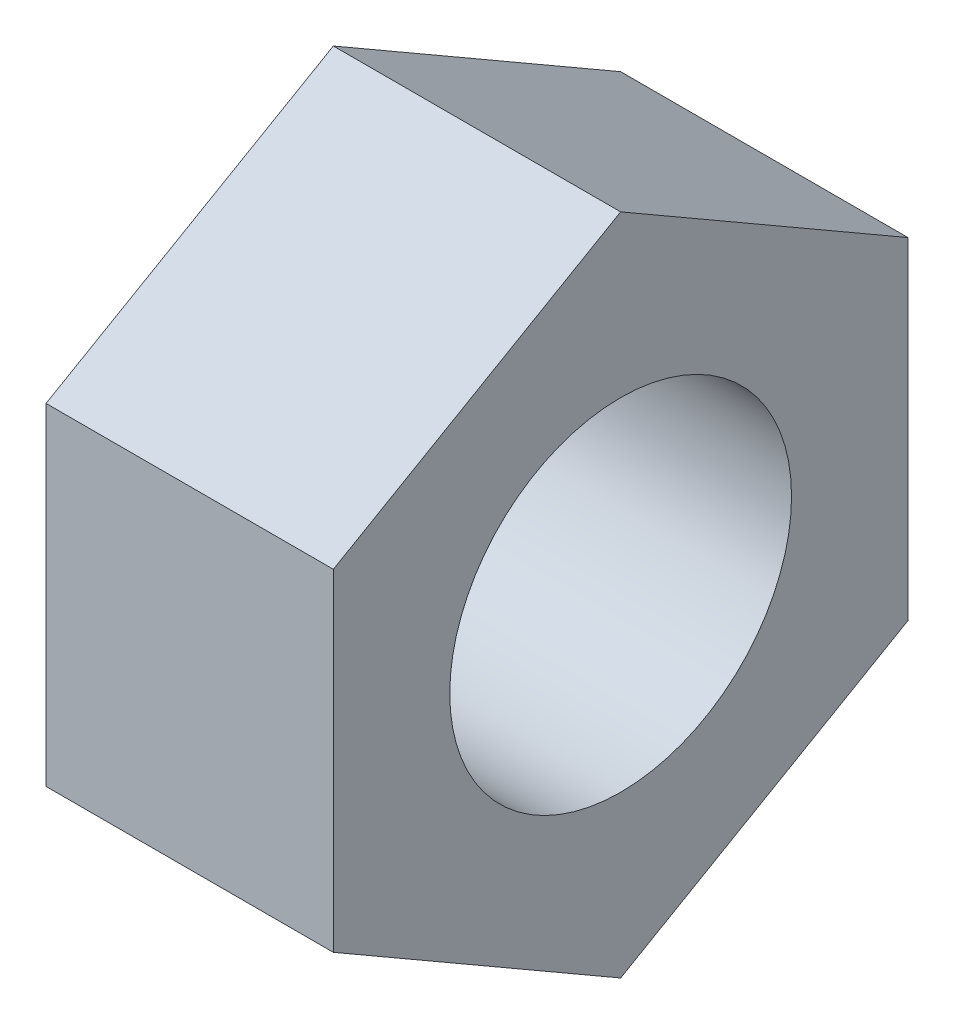
ISO-10303-21;
HEADER;
FILE_DESCRIPTION(('STEP AP214'),'2;1');
FILE_NAME('part.step','',(''),(''),'','','');
FILE_SCHEMA(('AUTOMOTIVE_DESIGN { 1 0 10303 214 1 1 1 1 }'));
ENDSEC;
DATA;
#1=APPLICATION_CONTEXT('core data for automotive mechanical design processes');
#2=APPLICATION_PROTOCOL_DEFINITION('international standard','automotive_design',2000,#1);
#3=PRODUCT_CONTEXT('',#1,'mechanical');
#4=PRODUCT('Part','Part','',(#3));
#5=PRODUCT_RELATED_PRODUCT_CATEGORY('part','',(#4));
#6=PRODUCT_DEFINITION_FORMATION('','',#4);
#7=PRODUCT_DEFINITION_CONTEXT('part definition',#1,'design');
#8=PRODUCT_DEFINITION('design','',#6,#7);
#9=PRODUCT_DEFINITION_SHAPE('','',#8);
#10=(LENGTH_UNIT() NAMED_UNIT(*) SI_UNIT(.MILLI.,.METRE.));
#11=(NAMED_UNIT(*) PLANE_ANGLE_UNIT() SI_UNIT($,.RADIAN.));
#12=(NAMED_UNIT(*) SI_UNIT($,.STERADIAN.) SOLID_ANGLE_UNIT());
#13=UNCERTAINTY_MEASURE_WITH_UNIT(LENGTH_MEASURE(1.E-05),#10,'distance_accuracy_value','');
#14=(GEOMETRIC_REPRESENTATION_CONTEXT(3) GLOBAL_UNCERTAINTY_ASSIGNED_CONTEXT((#13)) GLOBAL_UNIT_ASSIGNED_CONTEXT((#10,
#11,#12)) REPRESENTATION_CONTEXT('',''));
#15=CARTESIAN_POINT('',(0.,0.,0.));
#16=DIRECTION('',(0.,0.,1.));
#17=DIRECTION('',(1.,0.,0.));
#18=AXIS2_PLACEMENT_3D('',#15,#16,#17);
#19=CARTESIAN_POINT('',(5.33750000000024,-6.16321412359912,4.05925293378573E-13));
#20=DIRECTION('',(0.,0.866025403784406,0.499999999999973));
#21=DIRECTION('',(0.,-0.500000000000026,0.866025403784449));
#22=AXIS2_PLACEMENT_3D('',#19,#20,#21);
#23=PLANE('',#22);
#24=DIRECTION('',(0.,0.500000000000026,-0.866025403784449));
#25=VECTOR('',#24,1.);
#26=CARTESIAN_POINT('',(1.59594559789866E-13,-6.16321412359918,3.50414142147315E-13));
#27=LINE('',#26,#25);
#28=CARTESIAN_POINT('',(1.59594559789866E-13,-6.16321412359918,3.50414142147315E-13));
#29=VERTEX_POINT('',#28);
#30=CARTESIAN_POINT('',(2.91433543964104E-13,-3.08160706179937,-5.33749999999987));
#31=VERTEX_POINT('',#30);
#32=EDGE_CURVE('E118',#29,#31,#27,.T.);
#33=ORIENTED_EDGE('',*,*,#32,.T.);
#34=DIRECTION('',(-1.00000000000002,0.,0.));
#35=VECTOR('',#34,1.);
#36=CARTESIAN_POINT('',(5.33750000000014,-3.08160706179944,-5.33749999999983));
#37=LINE('',#36,#35);
#38=CARTESIAN_POINT('',(5.33750000000014,-3.08160706179944,-5.33749999999983));
#39=VERTEX_POINT('',#38);
#40=EDGE_CURVE('E11',#39,#31,#37,.T.);
#41=ORIENTED_EDGE('',*,*,#40,.F.);
#42=DIRECTION('',(0.,0.500000000000026,-0.866025403784449));
#43=VECTOR('',#42,1.);
#44=CARTESIAN_POINT('',(5.33750000000024,-6.16321412359912,4.05925293378573E-13));
#45=LINE('',#44,#43);
#46=CARTESIAN_POINT('',(5.33750000000024,-6.16321412359912,4.05925293378573E-13));
#47=VERTEX_POINT('',#46);
#48=EDGE_CURVE('E129',#47,#39,#45,.T.);
#49=ORIENTED_EDGE('',*,*,#48,.F.);
#50=DIRECTION('',(-1.00000000000002,0.,0.));
#51=VECTOR('',#50,1.);
#52=CARTESIAN_POINT('',(5.33750000000024,-6.16321412359912,4.05925293378573E-13));
#53=LINE('',#52,#51);
#54=EDGE_CURVE('E114',#47,#29,#53,.T.);
#55=ORIENTED_EDGE('',*,*,#54,.T.);
#56=EDGE_LOOP('',(#33,#41,#49,#55));
#57=FACE_BOUND('',#56,.T.);
#58=ADVANCED_FACE('F34',(#57),#23,.F.);
#59=CARTESIAN_POINT('',(5.33750000000014,-3.08160706179944,-5.33749999999983));
#60=DIRECTION('',(0.,0.,0.999999999999999));
#61=DIRECTION('',(0.,-0.999999999999989,0.));
#62=AXIS2_PLACEMENT_3D('',#59,#60,#61);
#63=PLANE('',#62);
#64=DIRECTION('',(0.,0.999999999999989,0.));
#65=VECTOR('',#64,1.);
#66=CARTESIAN_POINT('',(2.91433543964104E-13,-3.08160706179937,-5.33749999999987));
#67=LINE('',#66,#65);
#68=CARTESIAN_POINT('',(1.17961196366423E-13,3.0816070617998,-5.33750000000003));
#69=VERTEX_POINT('',#68);
#70=EDGE_CURVE('E121',#31,#69,#67,.T.);
#71=ORIENTED_EDGE('',*,*,#70,.T.);
#72=DIRECTION('',(-1.00000000000002,0.,0.));
#73=VECTOR('',#72,1.);
#74=CARTESIAN_POINT('',(5.33750000000011,3.08160706179987,-5.33749999999995));
#75=LINE('',#74,#73);
#76=CARTESIAN_POINT('',(5.33750000000011,3.08160706179987,-5.33749999999995));
#77=VERTEX_POINT('',#76);
#78=EDGE_CURVE('E42',#77,#69,#75,.T.);
#79=ORIENTED_EDGE('',*,*,#78,.F.);
#80=DIRECTION('',(0.,0.999999999999989,0.));
#81=VECTOR('',#80,1.);
#82=CARTESIAN_POINT('',(5.33750000000014,-3.08160706179944,-5.33749999999983));
#83=LINE('',#82,#81);
#84=EDGE_CURVE('E87',#39,#77,#83,.T.);
#85=ORIENTED_EDGE('',*,*,#84,.F.);
#86=ORIENTED_EDGE('',*,*,#40,.T.);
#87=EDGE_LOOP('',(#71,#79,#85,#86));
#88=FACE_BOUND('',#87,.T.);
#89=ADVANCED_FACE('F154',(#88),#63,.F.);
#90=CARTESIAN_POINT('',(5.33750000000011,3.08160706179987,-5.33749999999995));
#91=DIRECTION('',(0.,-0.86602540378445,0.500000000000025));
#92=DIRECTION('',(0.,-0.499999999999961,-0.866025403784423));
#93=AXIS2_PLACEMENT_3D('',#90,#91,#92);
#94=PLANE('',#93);
#95=DIRECTION('',(0.,0.499999999999961,0.866025403784422));
#96=VECTOR('',#95,1.);
#97=CARTESIAN_POINT('',(1.17961196366423E-13,3.0816070617998,-5.33750000000003));
#98=LINE('',#97,#96);
#99=CARTESIAN_POINT('',(2.22044604925031E-13,6.16321412359919,0.));
#100=VERTEX_POINT('',#99);
#101=EDGE_CURVE('E124',#69,#100,#98,.T.);
#102=ORIENTED_EDGE('',*,*,#101,.T.);
#103=DIRECTION('',(-1.00000000000002,0.,0.));
#104=VECTOR('',#103,1.);
#105=CARTESIAN_POINT('',(5.33750000000042,6.16321412359925,-1.2490009027033E-13));
#106=LINE('',#105,#104);
#107=CARTESIAN_POINT('',(5.33750000000042,6.16321412359925,-1.2490009027033E-13));
#108=VERTEX_POINT('',#107);
#109=EDGE_CURVE('E109',#108,#100,#106,.T.);
#110=ORIENTED_EDGE('',*,*,#109,.F.);
#111=DIRECTION('',(0.,0.499999999999961,0.866025403784422));
#112=VECTOR('',#111,1.);
#113=CARTESIAN_POINT('',(5.33750000000011,3.08160706179987,-5.33749999999995));
#114=LINE('',#113,#112);
#115=EDGE_CURVE('E100',#77,#108,#114,.T.);
#116=ORIENTED_EDGE('',*,*,#115,.F.);
#117=ORIENTED_EDGE('',*,*,#78,.T.);
#118=EDGE_LOOP('',(#102,#110,#116,#117));
#119=FACE_BOUND('',#118,.T.);
#120=ADVANCED_FACE('F135',(#119),#94,.F.);
#121=CARTESIAN_POINT('',(5.33750000000042,6.16321412359925,-1.2490009027033E-13));
#122=DIRECTION('',(0.,-0.866025403784406,-0.499999999999973));
#123=DIRECTION('',(0.,0.500000000000025,-0.86602540378445));
#124=AXIS2_PLACEMENT_3D('',#121,#122,#123);
#125=PLANE('',#124);
#126=DIRECTION('',(0.,-0.500000000000026,0.866025403784449));
#127=VECTOR('',#126,1.);
#128=CARTESIAN_POINT('',(2.22044604925031E-13,6.16321412359919,0.));
#129=LINE('',#128,#127);
#130=CARTESIAN_POINT('',(2.22044604925031E-13,3.08160706179936,5.33750000000004));
#131=VERTEX_POINT('',#130);
#132=EDGE_CURVE('E108',#100,#131,#129,.T.);
#133=ORIENTED_EDGE('',*,*,#132,.T.);
#134=DIRECTION('',(-1.00000000000002,0.,0.));
#135=VECTOR('',#134,1.);
#136=CARTESIAN_POINT('',(5.33750000000045,3.08160706179937,5.33750000000018));
#137=LINE('',#136,#135);
#138=CARTESIAN_POINT('',(5.33750000000045,3.08160706179937,5.33750000000018));
#139=VERTEX_POINT('',#138);
#140=EDGE_CURVE('E105',#139,#131,#137,.T.);
#141=ORIENTED_EDGE('',*,*,#140,.F.);
#142=DIRECTION('',(0.,-0.500000000000026,0.866025403784449));
#143=VECTOR('',#142,1.);
#144=CARTESIAN_POINT('',(5.33750000000042,6.16321412359925,-1.2490009027033E-13));
#145=LINE('',#144,#143);
#146=EDGE_CURVE('E94',#108,#139,#145,.T.);
#147=ORIENTED_EDGE('',*,*,#146,.F.);
#148=ORIENTED_EDGE('',*,*,#109,.T.);
#149=EDGE_LOOP('',(#133,#141,#147,#148));
#150=FACE_BOUND('',#149,.T.);
#151=ADVANCED_FACE('F106',(#150),#125,.F.);
#152=CARTESIAN_POINT('',(5.33750000000045,3.08160706179937,5.33750000000018));
#153=DIRECTION('',(0.,0.,-0.999999999999999));
#154=DIRECTION('',(-1.00000000000002,0.,0.));
#155=AXIS2_PLACEMENT_3D('',#152,#153,#154);
#156=PLANE('',#155);
#157=DIRECTION('',(0.,-0.999999999999989,0.));
#158=VECTOR('',#157,1.);
#159=CARTESIAN_POINT('',(2.22044604925031E-13,3.08160706179936,5.33750000000004));
#160=LINE('',#159,#158);
#161=CARTESIAN_POINT('',(2.08166817117217E-13,-3.08160706179984,5.33750000000007));
#162=VERTEX_POINT('',#161);
#163=EDGE_CURVE('E73',#131,#162,#160,.T.);
#164=ORIENTED_EDGE('',*,*,#163,.T.);
#165=DIRECTION('',(-1.00000000000002,0.,0.));
#166=VECTOR('',#165,1.);
#167=CARTESIAN_POINT('',(5.33750000000022,-3.08160706179976,5.33750000000005));
#168=LINE('',#167,#166);
#169=CARTESIAN_POINT('',(5.33750000000022,-3.08160706179976,5.33750000000005));
#170=VERTEX_POINT('',#169);
#171=EDGE_CURVE('E110',#170,#162,#168,.T.);
#172=ORIENTED_EDGE('',*,*,#171,.F.);
#173=DIRECTION('',(0.,-0.999999999999989,0.));
#174=VECTOR('',#173,1.);
#175=CARTESIAN_POINT('',(5.33750000000045,3.08160706179937,5.33750000000018));
#176=LINE('',#175,#174);
#177=EDGE_CURVE('E98',#139,#170,#176,.T.);
#178=ORIENTED_EDGE('',*,*,#177,.F.);
#179=ORIENTED_EDGE('',*,*,#140,.T.);
#180=EDGE_LOOP('',(#164,#172,#178,#179));
#181=FACE_BOUND('',#180,.T.);
#182=ADVANCED_FACE('F112',(#181),#156,.F.);
#183=CARTESIAN_POINT('',(5.33750000000022,-3.08160706179976,5.33750000000005));
#184=DIRECTION('',(0.,0.86602540378445,-0.500000000000025));
#185=DIRECTION('',(0.,0.499999999999961,0.866025403784423));
#186=AXIS2_PLACEMENT_3D('',#183,#184,#185);
#187=PLANE('',#186);
#188=DIRECTION('',(0.,-0.499999999999961,-0.866025403784422));
#189=VECTOR('',#188,1.);
#190=CARTESIAN_POINT('',(2.08166817117217E-13,-3.08160706179984,5.33750000000007));
#191=LINE('',#190,#189);
#192=EDGE_CURVE('E79',#162,#29,#191,.T.);
#193=ORIENTED_EDGE('',*,*,#192,.T.);
#194=ORIENTED_EDGE('',*,*,#54,.F.);
#195=DIRECTION('',(0.,-0.499999999999961,-0.866025403784422));
#196=VECTOR('',#195,1.);
#197=CARTESIAN_POINT('',(5.33750000000022,-3.08160706179976,5.33750000000005));
#198=LINE('',#197,#196);
#199=EDGE_CURVE('E50',#170,#47,#198,.T.);
#200=ORIENTED_EDGE('',*,*,#199,.F.);
#201=ORIENTED_EDGE('',*,*,#171,.T.);
#202=EDGE_LOOP('',(#193,#194,#200,#201));
#203=FACE_BOUND('',#202,.T.);
#204=ADVANCED_FACE('F142',(#203),#187,.F.);
#205=CARTESIAN_POINT('',(5.33750000000022,0.,0.));
#206=DIRECTION('',(1.00000000000002,0.,0.));
#207=DIRECTION('',(0.,0.,-0.999999999999999));
#208=AXIS2_PLACEMENT_3D('',#205,#206,#207);
#209=PLANE('',#208);
#210=CARTESIAN_POINT('',(5.33750000000022,0.,0.));
#211=DIRECTION('',(-1.00000000000002,0.,0.));
#212=DIRECTION('',(0.,0.,0.999999999999999));
#213=AXIS2_PLACEMENT_3D('',#210,#211,#212);
#214=CIRCLE('',#213,3.175);
#215=CARTESIAN_POINT('',(5.33750000000025,-1.81368430796584E-13,3.175));
#216=VERTEX_POINT('',#215);
#217=EDGE_CURVE('E122',#216,#216,#214,.T.);
#218=ORIENTED_EDGE('',*,*,#217,.T.);
#219=EDGE_LOOP('',(#218));
#220=FACE_BOUND('',#219,.T.);
#221=ORIENTED_EDGE('',*,*,#48,.T.);
#222=ORIENTED_EDGE('',*,*,#84,.T.);
#223=ORIENTED_EDGE('',*,*,#115,.T.);
#224=ORIENTED_EDGE('',*,*,#146,.T.);
#225=ORIENTED_EDGE('',*,*,#177,.T.);
#226=ORIENTED_EDGE('',*,*,#199,.T.);
#227=EDGE_LOOP('',(#221,#222,#223,#224,#225,#226));
#228=FACE_BOUND('',#227,.T.);
#229=ADVANCED_FACE('F96',(#220,#228),#209,.T.);
#230=CARTESIAN_POINT('',(0.,0.,0.));
#231=DIRECTION('',(1.00000000000002,0.,0.));
#232=DIRECTION('',(0.,0.,-0.999999999999999));
#233=AXIS2_PLACEMENT_3D('',#230,#231,#232);
#234=PLANE('',#233);
#235=CARTESIAN_POINT('',(0.,0.,0.));
#236=DIRECTION('',(-1.00000000000002,0.,0.));
#237=DIRECTION('',(0.,0.,0.999999999999999));
#238=AXIS2_PLACEMENT_3D('',#235,#236,#237);
#239=CIRCLE('',#238,3.175);
#240=CARTESIAN_POINT('',(0.,-1.25857279565327E-13,3.175));
#241=VERTEX_POINT('',#240);
#242=EDGE_CURVE('E199',#241,#241,#239,.T.);
#243=ORIENTED_EDGE('',*,*,#242,.F.);
#244=EDGE_LOOP('',(#243));
#245=FACE_BOUND('',#244,.T.);
#246=ORIENTED_EDGE('',*,*,#32,.F.);
#247=ORIENTED_EDGE('',*,*,#192,.F.);
#248=ORIENTED_EDGE('',*,*,#163,.F.);
#249=ORIENTED_EDGE('',*,*,#132,.F.);
#250=ORIENTED_EDGE('',*,*,#101,.F.);
#251=ORIENTED_EDGE('',*,*,#70,.F.);
#252=EDGE_LOOP('',(#246,#247,#248,#249,#250,#251));
#253=FACE_BOUND('',#252,.T.);
#254=ADVANCED_FACE('F138',(#245,#253),#234,.F.);
#255=CARTESIAN_POINT('',(5.33750000000022,0.,0.));
#256=DIRECTION('',(-1.00000000000002,0.,0.));
#257=DIRECTION('',(0.,0.,0.999999999999999));
#258=AXIS2_PLACEMENT_3D('',#255,#256,#257);
#259=CYLINDRICAL_SURFACE('',#258,3.175);
#260=ORIENTED_EDGE('',*,*,#217,.F.);
#261=EDGE_LOOP('',(#260));
#262=FACE_BOUND('',#261,.T.);
#263=ORIENTED_EDGE('',*,*,#242,.T.);
#264=EDGE_LOOP('',(#263));
#265=FACE_BOUND('',#264,.T.);
#266=ADVANCED_FACE('F185',(#262,#265),#259,.F.);
#267=CLOSED_SHELL('',(#58,#89,#120,#151,#182,#204,#229,#254,#266));
#268=MANIFOLD_SOLID_BREP('B2',#267);
#269=ADVANCED_BREP_SHAPE_REPRESENTATION('',(#18,#268),#14);
#270=SHAPE_DEFINITION_REPRESENTATION(#9,#269);
ENDSEC;
END-ISO-10303-21;
